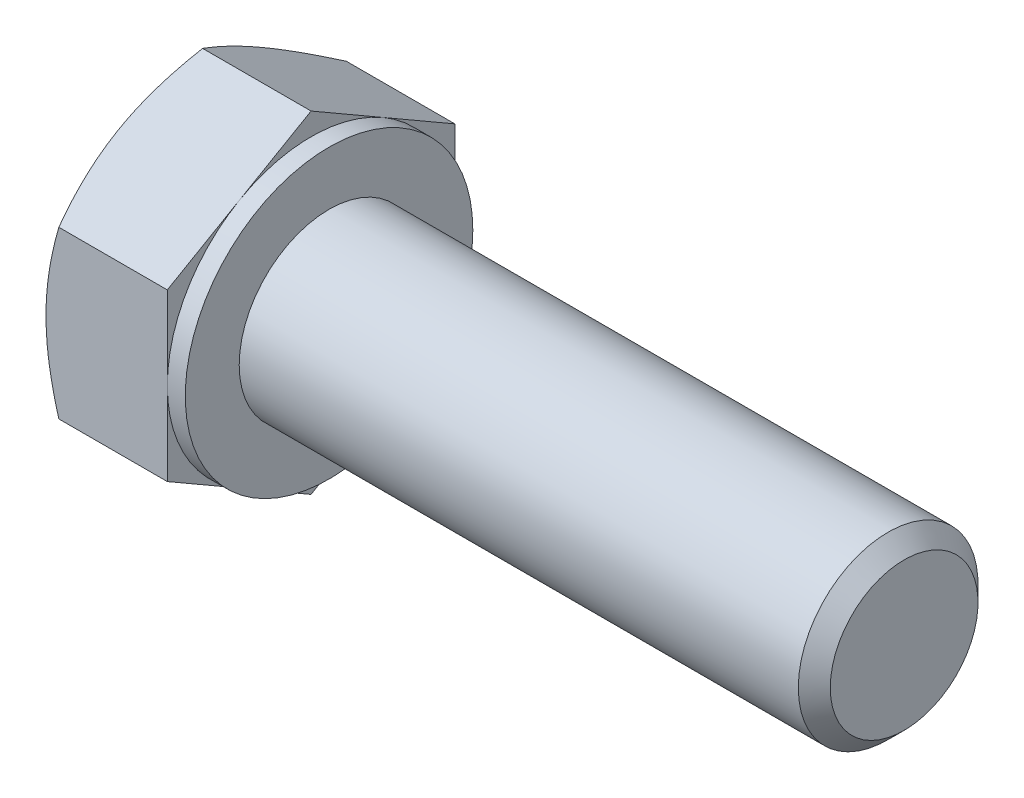
ISO-10303-21;
HEADER;
FILE_DESCRIPTION(('STEP AP214'),'2;1');
FILE_NAME('part.step','',(''),(''),'','','');
FILE_SCHEMA(('AUTOMOTIVE_DESIGN { 1 0 10303 214 1 1 1 1 }'));
ENDSEC;
DATA;
#1=APPLICATION_CONTEXT('core data for automotive mechanical design processes');
#2=APPLICATION_PROTOCOL_DEFINITION('international standard','automotive_design',2000,#1);
#3=PRODUCT_CONTEXT('',#1,'mechanical');
#4=PRODUCT('Part','Part','',(#3));
#5=PRODUCT_RELATED_PRODUCT_CATEGORY('part','',(#4));
#6=PRODUCT_DEFINITION_FORMATION('','',#4);
#7=PRODUCT_DEFINITION_CONTEXT('part definition',#1,'design');
#8=PRODUCT_DEFINITION('design','',#6,#7);
#9=PRODUCT_DEFINITION_SHAPE('','',#8);
#10=(LENGTH_UNIT() NAMED_UNIT(*) SI_UNIT(.MILLI.,.METRE.));
#11=(NAMED_UNIT(*) PLANE_ANGLE_UNIT() SI_UNIT($,.RADIAN.));
#12=(NAMED_UNIT(*) SI_UNIT($,.STERADIAN.) SOLID_ANGLE_UNIT());
#13=UNCERTAINTY_MEASURE_WITH_UNIT(LENGTH_MEASURE(1.E-05),#10,'distance_accuracy_value','');
#14=(GEOMETRIC_REPRESENTATION_CONTEXT(3) GLOBAL_UNCERTAINTY_ASSIGNED_CONTEXT((#13)) GLOBAL_UNIT_ASSIGNED_CONTEXT((#10,
#11,#12)) REPRESENTATION_CONTEXT('',''));
#15=CARTESIAN_POINT('',(0.,0.,0.));
#16=DIRECTION('',(0.,0.,1.));
#17=DIRECTION('',(1.,0.,0.));
#18=AXIS2_PLACEMENT_3D('',#15,#16,#17);
#19=CARTESIAN_POINT('',(3.875,4.61880215351701,0.));
#20=DIRECTION('',(1.,0.,0.));
#21=DIRECTION('',(0.,0.,-1.));
#22=AXIS2_PLACEMENT_3D('',#19,#20,#21);
#23=PLANE('',#22);
#24=CARTESIAN_POINT('',(3.875,0.,0.));
#25=DIRECTION('',(1.,0.,0.));
#26=DIRECTION('',(0.,0.,-1.));
#27=AXIS2_PLACEMENT_3D('',#24,#25,#26);
#28=CIRCLE('',#27,2.5);
#29=CARTESIAN_POINT('',(3.875,0.,-2.5));
#30=VERTEX_POINT('',#29);
#31=EDGE_CURVE('E306',#30,#30,#28,.F.);
#32=ORIENTED_EDGE('',*,*,#31,.T.);
#33=EDGE_LOOP('',(#32));
#34=FACE_BOUND('',#33,.T.);
#35=CARTESIAN_POINT('',(3.875,0.,0.));
#36=DIRECTION('',(1.,0.,0.));
#37=DIRECTION('',(0.,0.,-1.));
#38=AXIS2_PLACEMENT_3D('',#35,#36,#37);
#39=CIRCLE('',#38,4.);
#40=CARTESIAN_POINT('',(3.875,0.,-4.));
#41=VERTEX_POINT('',#40);
#42=EDGE_CURVE('E333',#41,#41,#39,.T.);
#43=ORIENTED_EDGE('',*,*,#42,.T.);
#44=EDGE_LOOP('',(#43));
#45=FACE_BOUND('',#44,.T.);
#46=ADVANCED_FACE('F45',(#34,#45),#23,.T.);
#47=CARTESIAN_POINT('',(0.,0.,0.));
#48=DIRECTION('',(-1.,0.,0.));
#49=DIRECTION('',(0.,0.,1.));
#50=AXIS2_PLACEMENT_3D('',#47,#48,#49);
#51=CYLINDRICAL_SURFACE('',#50,2.5);
#52=ORIENTED_EDGE('',*,*,#31,.F.);
#53=EDGE_LOOP('',(#52));
#54=FACE_BOUND('',#53,.T.);
#55=CARTESIAN_POINT('',(19.43,0.,0.));
#56=DIRECTION('',(-1.,0.,0.));
#57=DIRECTION('',(0.,0.,1.));
#58=AXIS2_PLACEMENT_3D('',#55,#56,#57);
#59=CIRCLE('',#58,2.5);
#60=CARTESIAN_POINT('',(19.43,0.,2.5));
#61=VERTEX_POINT('',#60);
#62=EDGE_CURVE('E300',#61,#61,#59,.T.);
#63=ORIENTED_EDGE('',*,*,#62,.T.);
#64=EDGE_LOOP('',(#63));
#65=FACE_BOUND('',#64,.T.);
#66=ADVANCED_FACE('F273',(#54,#65),#51,.T.);
#67=CARTESIAN_POINT('',(19.875,0.,0.));
#68=DIRECTION('',(-1.,0.,0.));
#69=DIRECTION('',(0.,0.,1.));
#70=AXIS2_PLACEMENT_3D('',#67,#68,#69);
#71=CONICAL_SURFACE('',#70,2.055,0.785398163397448);
#72=ORIENTED_EDGE('',*,*,#62,.F.);
#73=EDGE_LOOP('',(#72));
#74=FACE_BOUND('',#73,.T.);
#75=CARTESIAN_POINT('',(19.875,0.,0.));
#76=DIRECTION('',(-1.,0.,0.));
#77=DIRECTION('',(0.,0.,1.));
#78=AXIS2_PLACEMENT_3D('',#75,#76,#77);
#79=CIRCLE('',#78,2.055);
#80=CARTESIAN_POINT('',(19.875,0.,2.055));
#81=VERTEX_POINT('',#80);
#82=EDGE_CURVE('E297',#81,#81,#79,.T.);
#83=ORIENTED_EDGE('',*,*,#82,.T.);
#84=EDGE_LOOP('',(#83));
#85=FACE_BOUND('',#84,.T.);
#86=ADVANCED_FACE('F278',(#74,#85),#71,.T.);
#87=CARTESIAN_POINT('',(19.875,0.,0.));
#88=DIRECTION('',(-1.,0.,0.));
#89=DIRECTION('',(0.,0.,1.));
#90=AXIS2_PLACEMENT_3D('',#87,#88,#89);
#91=PLANE('',#90);
#92=ORIENTED_EDGE('',*,*,#82,.F.);
#93=EDGE_LOOP('',(#92));
#94=FACE_BOUND('',#93,.T.);
#95=ADVANCED_FACE('F285',(#94),#91,.F.);
#96=CARTESIAN_POINT('',(3.375,4.,0.));
#97=DIRECTION('',(1.,0.,0.));
#98=DIRECTION('',(0.,0.,-1.));
#99=AXIS2_PLACEMENT_3D('',#96,#97,#98);
#100=PLANE('',#99);
#101=DIRECTION('',(0.,0.500000000000002,0.866025403784438));
#102=VECTOR('',#101,1.);
#103=CARTESIAN_POINT('',(3.375,2.3094010767585,-4.));
#104=LINE('',#103,#102);
#105=CARTESIAN_POINT('',(3.375,2.3094010767585,-4.));
#106=VERTEX_POINT('',#105);
#107=CARTESIAN_POINT('',(3.375,3.46410161513775,-2.00000000000001));
#108=VERTEX_POINT('',#107);
#109=EDGE_CURVE('E187',#106,#108,#104,.T.);
#110=ORIENTED_EDGE('',*,*,#109,.T.);
#111=CARTESIAN_POINT('',(3.375,0.,0.));
#112=DIRECTION('',(-1.,0.,0.));
#113=DIRECTION('',(0.,0.,1.));
#114=AXIS2_PLACEMENT_3D('',#111,#112,#113);
#115=CIRCLE('',#114,4.);
#116=CARTESIAN_POINT('',(3.375,0.,-4.));
#117=VERTEX_POINT('',#116);
#118=EDGE_CURVE('E62',#108,#117,#115,.T.);
#119=ORIENTED_EDGE('',*,*,#118,.T.);
#120=DIRECTION('',(0.,1.,0.));
#121=VECTOR('',#120,1.);
#122=CARTESIAN_POINT('',(3.375,2.3094010767585,-4.));
#123=LINE('',#122,#121);
#124=EDGE_CURVE('E50',#117,#106,#123,.T.);
#125=ORIENTED_EDGE('',*,*,#124,.T.);
#126=EDGE_LOOP('',(#110,#119,#125));
#127=FACE_BOUND('',#126,.T.);
#128=ADVANCED_FACE('F288',(#127),#100,.T.);
#129=CARTESIAN_POINT('',(3.375,4.61880215351701,0.));
#130=VERTEX_POINT('',#129);
#131=EDGE_CURVE('E184',#108,#130,#104,.T.);
#132=ORIENTED_EDGE('',*,*,#131,.T.);
#133=DIRECTION('',(0.,-0.500000000000001,0.866025403784438));
#134=VECTOR('',#133,1.);
#135=CARTESIAN_POINT('',(3.375,4.61880215351701,0.));
#136=LINE('',#135,#134);
#137=CARTESIAN_POINT('',(3.375,3.46410161513775,2.));
#138=VERTEX_POINT('',#137);
#139=EDGE_CURVE('E183',#130,#138,#136,.T.);
#140=ORIENTED_EDGE('',*,*,#139,.T.);
#141=EDGE_CURVE('E167',#138,#108,#115,.T.);
#142=ORIENTED_EDGE('',*,*,#141,.T.);
#143=EDGE_LOOP('',(#132,#140,#142));
#144=FACE_BOUND('',#143,.T.);
#145=ADVANCED_FACE('F293',(#144),#100,.T.);
#146=CARTESIAN_POINT('',(3.375,2.30940107675851,3.99999999999999));
#147=VERTEX_POINT('',#146);
#148=EDGE_CURVE('E144',#138,#147,#136,.T.);
#149=ORIENTED_EDGE('',*,*,#148,.T.);
#150=DIRECTION('',(0.,-1.,0.));
#151=VECTOR('',#150,1.);
#152=CARTESIAN_POINT('',(3.375,2.30940107675851,3.99999999999999));
#153=LINE('',#152,#151);
#154=CARTESIAN_POINT('',(3.375,0.,4.));
#155=VERTEX_POINT('',#154);
#156=EDGE_CURVE('E138',#147,#155,#153,.T.);
#157=ORIENTED_EDGE('',*,*,#156,.T.);
#158=EDGE_CURVE('E142',#155,#138,#115,.T.);
#159=ORIENTED_EDGE('',*,*,#158,.T.);
#160=EDGE_LOOP('',(#149,#157,#159));
#161=FACE_BOUND('',#160,.T.);
#162=ADVANCED_FACE('F140',(#161),#100,.T.);
#163=CARTESIAN_POINT('',(3.375,-2.30940107675848,4.));
#164=VERTEX_POINT('',#163);
#165=EDGE_CURVE('E149',#155,#164,#153,.T.);
#166=ORIENTED_EDGE('',*,*,#165,.T.);
#167=DIRECTION('',(0.,-0.500000000000002,-0.866025403784438));
#168=VECTOR('',#167,1.);
#169=CARTESIAN_POINT('',(3.375,-4.618802153517,0.));
#170=LINE('',#169,#168);
#171=CARTESIAN_POINT('',(3.375,-3.46410161513775,2.00000000000001));
#172=VERTEX_POINT('',#171);
#173=EDGE_CURVE('E156',#164,#172,#170,.T.);
#174=ORIENTED_EDGE('',*,*,#173,.T.);
#175=EDGE_CURVE('E153',#172,#155,#115,.T.);
#176=ORIENTED_EDGE('',*,*,#175,.T.);
#177=EDGE_LOOP('',(#166,#174,#176));
#178=FACE_BOUND('',#177,.T.);
#179=ADVANCED_FACE('F154',(#178),#100,.T.);
#180=CARTESIAN_POINT('',(3.375,-4.618802153517,0.));
#181=VERTEX_POINT('',#180);
#182=EDGE_CURVE('E177',#172,#181,#170,.T.);
#183=ORIENTED_EDGE('',*,*,#182,.T.);
#184=DIRECTION('',(0.,0.499999999999999,-0.866025403784439));
#185=VECTOR('',#184,1.);
#186=CARTESIAN_POINT('',(3.375,-2.3094010767585,-4.));
#187=LINE('',#186,#185);
#188=CARTESIAN_POINT('',(3.375,-3.46410161513776,-1.99999999999999));
#189=VERTEX_POINT('',#188);
#190=EDGE_CURVE('E428',#181,#189,#187,.T.);
#191=ORIENTED_EDGE('',*,*,#190,.T.);
#192=EDGE_CURVE('E161',#189,#172,#115,.T.);
#193=ORIENTED_EDGE('',*,*,#192,.T.);
#194=EDGE_LOOP('',(#183,#191,#193));
#195=FACE_BOUND('',#194,.T.);
#196=ADVANCED_FACE('F537',(#195),#100,.T.);
#197=CARTESIAN_POINT('',(3.375,-2.3094010767585,-4.));
#198=VERTEX_POINT('',#197);
#199=EDGE_CURVE('E169',#189,#198,#187,.T.);
#200=ORIENTED_EDGE('',*,*,#199,.T.);
#201=EDGE_CURVE('E11',#198,#117,#123,.T.);
#202=ORIENTED_EDGE('',*,*,#201,.T.);
#203=EDGE_CURVE('E434',#117,#189,#115,.T.);
#204=ORIENTED_EDGE('',*,*,#203,.T.);
#205=EDGE_LOOP('',(#200,#202,#204));
#206=FACE_BOUND('',#205,.T.);
#207=ADVANCED_FACE('F294',(#206),#100,.T.);
#208=CARTESIAN_POINT('',(0.,0.,0.));
#209=DIRECTION('',(-1.,0.,0.));
#210=DIRECTION('',(0.,0.,1.));
#211=AXIS2_PLACEMENT_3D('',#208,#209,#210);
#212=CYLINDRICAL_SURFACE('',#211,4.);
#213=ORIENTED_EDGE('',*,*,#118,.F.);
#214=ORIENTED_EDGE('',*,*,#141,.F.);
#215=ORIENTED_EDGE('',*,*,#158,.F.);
#216=ORIENTED_EDGE('',*,*,#175,.F.);
#217=ORIENTED_EDGE('',*,*,#192,.F.);
#218=ORIENTED_EDGE('',*,*,#203,.F.);
#219=EDGE_LOOP('',(#213,#214,#215,#216,#217,#218));
#220=FACE_BOUND('',#219,.T.);
#221=ORIENTED_EDGE('',*,*,#42,.F.);
#222=EDGE_LOOP('',(#221));
#223=FACE_BOUND('',#222,.T.);
#224=ADVANCED_FACE('F164',(#220,#223),#212,.T.);
#225=CARTESIAN_POINT('',(0.,4.61880215351701,0.));
#226=DIRECTION('',(1.,0.,0.));
#227=DIRECTION('',(0.,0.,-1.));
#228=AXIS2_PLACEMENT_3D('',#225,#226,#227);
#229=PLANE('',#228);
#230=CARTESIAN_POINT('',(0.,0.,0.));
#231=DIRECTION('',(1.,0.,0.));
#232=DIRECTION('',(0.,0.,-1.));
#233=AXIS2_PLACEMENT_3D('',#230,#231,#232);
#234=CIRCLE('',#233,4.);
#235=CARTESIAN_POINT('',(0.,0.,-4.));
#236=VERTEX_POINT('',#235);
#237=CARTESIAN_POINT('',(0.,3.46410161513775,-2.00000000000001));
#238=VERTEX_POINT('',#237);
#239=EDGE_CURVE('E332',#236,#238,#234,.T.);
#240=ORIENTED_EDGE('',*,*,#239,.F.);
#241=CARTESIAN_POINT('',(0.,-3.46410161513776,-1.99999999999999));
#242=VERTEX_POINT('',#241);
#243=EDGE_CURVE('E328',#242,#236,#234,.T.);
#244=ORIENTED_EDGE('',*,*,#243,.F.);
#245=CARTESIAN_POINT('',(0.,-3.46410161513775,2.00000000000001));
#246=VERTEX_POINT('',#245);
#247=EDGE_CURVE('E331',#246,#242,#234,.T.);
#248=ORIENTED_EDGE('',*,*,#247,.F.);
#249=CARTESIAN_POINT('',(0.,0.,4.));
#250=VERTEX_POINT('',#249);
#251=EDGE_CURVE('E347',#250,#246,#234,.T.);
#252=ORIENTED_EDGE('',*,*,#251,.F.);
#253=CARTESIAN_POINT('',(0.,0.,0.));
#254=DIRECTION('',(-1.,0.,0.));
#255=DIRECTION('',(0.,0.,1.));
#256=AXIS2_PLACEMENT_3D('',#253,#254,#255);
#257=CIRCLE('',#256,4.);
#258=CARTESIAN_POINT('',(0.,3.46410161513775,2.));
#259=VERTEX_POINT('',#258);
#260=EDGE_CURVE('E188',#250,#259,#257,.T.);
#261=ORIENTED_EDGE('',*,*,#260,.T.);
#262=EDGE_CURVE('E340',#238,#259,#234,.T.);
#263=ORIENTED_EDGE('',*,*,#262,.F.);
#264=EDGE_LOOP('',(#240,#244,#248,#252,#261,#263));
#265=FACE_BOUND('',#264,.T.);
#266=ADVANCED_FACE('F221',(#265),#229,.F.);
#267=CARTESIAN_POINT('',(0.,0.,0.));
#268=DIRECTION('',(1.,0.,0.));
#269=DIRECTION('',(0.,0.,-1.));
#270=AXIS2_PLACEMENT_3D('',#267,#268,#269);
#271=CONICAL_SURFACE('',#270,4.,1.0471975511966);
#272=CARTESIAN_POINT('',(0.357332259074764,2.30928560670467,4.00019999999999));
#273=CARTESIAN_POINT('',(0.29871787364828,2.41077174646171,3.82442084967676));
#274=CARTESIAN_POINT('',(0.245410321462261,2.513133908835,3.64712438367361));
#275=CARTESIAN_POINT('',(0.152361670746402,2.71963072479812,3.28946140682429));
#276=CARTESIAN_POINT('',(0.112653489029703,2.82376904741905,3.10908854102984));
#277=CARTESIAN_POINT('',(0.0508422152802788,3.03075510011796,2.7505781812972));
#278=CARTESIAN_POINT('',(0.028327731522889,3.13357098372492,2.57249584706485));
#279=CARTESIAN_POINT('',(0.00145062314658275,3.33968651028529,2.21549328283349));
#280=CARTESIAN_POINT('',(-0.00293425857305552,3.44298540411435,2.03657435035589));
#281=CARTESIAN_POINT('',(0.00619007293997221,3.63600352522933,1.70225715780326));
#282=CARTESIAN_POINT('',(0.0174589539879965,3.72575165335065,1.54680884001293));
#283=CARTESIAN_POINT('',(0.0531739907981958,3.90466320392055,1.23692494436494));
#284=CARTESIAN_POINT('',(0.0776323457115357,3.99382600759479,1.08249043825587));
#285=CARTESIAN_POINT('',(0.138776064919292,4.17310641015198,0.77196767222542));
#286=CARTESIAN_POINT('',(0.175720603654866,4.26320131938132,0.615918711936896));
#287=CARTESIAN_POINT('',(0.25957007254803,4.44204742827551,0.30614816459616));
#288=CARTESIAN_POINT('',(0.306455302212743,4.53080091904967,0.152422609226221));
#289=CARTESIAN_POINT('',(0.35733225907477,4.61891762357085,-0.000200000000000127));
#290=B_SPLINE_CURVE_WITH_KNOTS('',3,(#272,#273,#274,#275,#276,#277,#278,#279,#280,#281,#282,
#283,#284,#285,#286,#287,#288,#289),.UNSPECIFIED.,.F.,.F.,(4,2,2,2,2,2,2,2,4),(0.,
0.634047835695966,1.26961969224543,1.88946157213122,2.50854226669297,3.04757825393385,
3.58711366126903,4.13861653143763,4.68903648037742),.UNSPECIFIED.);
#291=CARTESIAN_POINT('',(0.357265589908165,4.61880215351701,0.));
#292=VERTEX_POINT('',#291);
#293=EDGE_CURVE('E241',#259,#292,#290,.T.);
#294=ORIENTED_EDGE('',*,*,#293,.T.);
#295=CARTESIAN_POINT('',(0.357332259074769,4.61891762357085,0.000200000000000014));
#296=CARTESIAN_POINT('',(0.298717873648285,4.51743148381381,-0.175579150323228));
#297=CARTESIAN_POINT('',(0.245410321462265,4.41506932144052,-0.352875616326381));
#298=CARTESIAN_POINT('',(0.152361670746406,4.2085725054774,-0.710538593175707));
#299=CARTESIAN_POINT('',(0.112653489029706,4.10443418285647,-0.890911458970151));
#300=CARTESIAN_POINT('',(0.0508422152802806,3.89744813015756,-1.24942181870279));
#301=CARTESIAN_POINT('',(0.0283277315228901,3.7946322465506,-1.42750415293514));
#302=CARTESIAN_POINT('',(0.00145062314658247,3.58851671999023,-1.78450671716651));
#303=CARTESIAN_POINT('',(-0.00293425857305642,3.48521782616117,-1.9634256496441));
#304=CARTESIAN_POINT('',(0.0061900729399703,3.29219970504619,-2.29774284219673));
#305=CARTESIAN_POINT('',(0.0174589539879942,3.20245157692486,-2.45319115998707));
#306=CARTESIAN_POINT('',(0.0531739907981929,3.02354002635497,-2.76307505563506));
#307=CARTESIAN_POINT('',(0.0776323457115325,2.93437722268073,-2.91750956174413));
#308=CARTESIAN_POINT('',(0.138776064919288,2.75509682012354,-3.22803232777458));
#309=CARTESIAN_POINT('',(0.175720603654862,2.6650019108942,-3.3840812880631));
#310=CARTESIAN_POINT('',(0.259570072548025,2.486155802,-3.69385183540384));
#311=CARTESIAN_POINT('',(0.306455302212738,2.39740231122584,-3.84757739077378));
#312=CARTESIAN_POINT('',(0.357332259074764,2.30928560670466,-4.0002));
#313=B_SPLINE_CURVE_WITH_KNOTS('',3,(#295,#296,#297,#298,#299,#300,#301,#302,#303,#304,#305,
#306,#307,#308,#309,#310,#311,#312),.UNSPECIFIED.,.F.,.F.,(4,2,2,2,2,2,2,2,4),(0.,
0.634047835695967,1.26961969224544,1.88946157213122,2.50854226669297,3.04757825393386,
3.58711366126904,4.13861653143764,4.68903648037744),.UNSPECIFIED.);
#314=EDGE_CURVE('E70',#292,#238,#313,.T.);
#315=ORIENTED_EDGE('',*,*,#314,.T.);
#316=ORIENTED_EDGE('',*,*,#262,.T.);
#317=EDGE_LOOP('',(#294,#315,#316));
#318=FACE_BOUND('',#317,.T.);
#319=ADVANCED_FACE('F452',(#318),#271,.T.);
#320=CARTESIAN_POINT('',(2.00011120385046,-6.3020384234118,4.));
#321=CARTESIAN_POINT('',(1.91454696302706,-6.12645846502783,4.));
#322=CARTESIAN_POINT('',(1.82977515690346,-5.95048585438814,4.));
#323=CARTESIAN_POINT('',(1.66226027661303,-5.59754684141579,4.));
#324=CARTESIAN_POINT('',(1.57951750403357,-5.42058029609573,4.));
#325=CARTESIAN_POINT('',(1.4161092617051,-5.06457985037646,4.));
#326=CARTESIAN_POINT('',(1.33545672605323,-4.88553999327038,4.));
#327=CARTESIAN_POINT('',(1.17732357965482,-4.52607013031636,4.));
#328=CARTESIAN_POINT('',(1.09984282527701,-4.34564018785782,4.));
#329=CARTESIAN_POINT('',(0.946328317401932,-3.97695712218341,4.));
#330=CARTESIAN_POINT('',(0.870432703669638,-3.78864617451162,4.));
#331=CARTESIAN_POINT('',(0.724150215280466,-3.40985798807119,4.));
#332=CARTESIAN_POINT('',(0.653763944661545,-3.21938051438195,4.));
#333=CARTESIAN_POINT('',(0.520275623047364,-2.83628176991271,4.));
#334=CARTESIAN_POINT('',(0.45715965099107,-2.64366539743604,4.));
#335=CARTESIAN_POINT('',(0.340171517307153,-2.25567134243401,4.));
#336=CARTESIAN_POINT('',(0.286296547451801,-2.0602945183805,4.));
#337=CARTESIAN_POINT('',(0.190596079734454,-1.66775019550377,4.));
#338=CARTESIAN_POINT('',(0.148703055513719,-1.47059946088018,4.));
#339=CARTESIAN_POINT('',(0.0792701946386882,-1.07374632394225,4.));
#340=CARTESIAN_POINT('',(0.0517287926791938,-0.874044202338187,4.));
#341=CARTESIAN_POINT('',(0.0135517370726247,-0.475733693101267,4.));
#342=CARTESIAN_POINT('',(0.00269106574828705,-0.277147419592167,4.));
#343=CARTESIAN_POINT('',(-0.00180277188208441,0.120241435280114,4.));
#344=CARTESIAN_POINT('',(0.00456430925773631,0.319044019709218,4.));
#345=CARTESIAN_POINT('',(0.0293199840216128,0.653649130511212,4.));
#346=CARTESIAN_POINT('',(0.0433487693682711,0.789796203877412,3.99999999999999));
#347=CARTESIAN_POINT('',(0.078665058314609,1.06115179654903,3.99999999999999));
#348=CARTESIAN_POINT('',(0.0999534649347827,1.19636019695748,3.99999999999999));
#349=CARTESIAN_POINT('',(0.173595112588807,1.60036108675972,3.99999999999999));
#350=CARTESIAN_POINT('',(0.235713609104601,1.86739657992387,3.99999999999999));
#351=CARTESIAN_POINT('',(0.344187906710576,2.26690842076046,3.99999999999999));
#352=CARTESIAN_POINT('',(0.383434483337922,2.40143348236976,3.99999999999999));
#353=CARTESIAN_POINT('',(0.466191101497679,2.6691784914414,3.99999999999999));
#354=CARTESIAN_POINT('',(0.509701176020063,2.8023984287962,3.99999999999999));
#355=CARTESIAN_POINT('',(0.600271093153284,3.06757339019426,3.99999999999999));
#356=CARTESIAN_POINT('',(0.647329942526204,3.19952875660039,3.99999999999999));
#357=CARTESIAN_POINT('',(0.744425095187852,3.46233233841869,3.99999999999999));
#358=CARTESIAN_POINT('',(0.79446132942051,3.59318057942866,3.99999999999999));
#359=CARTESIAN_POINT('',(0.933355738336686,3.94627302000952,3.99999999999999));
#360=CARTESIAN_POINT('',(1.02459875944488,4.16757823468635,3.99999999999999));
#361=CARTESIAN_POINT('',(1.21247228327858,4.60789849544448,3.99999999999999));
#362=CARTESIAN_POINT('',(1.30910339202328,4.82691328060903,3.99999999999999));
#363=CARTESIAN_POINT('',(1.50647026541792,5.26317250155478,3.99999999999999));
#364=CARTESIAN_POINT('',(1.60720746834517,5.48041628445573,3.99999999999999));
#365=CARTESIAN_POINT('',(1.81181128465854,5.91342831583171,3.99999999999999));
#366=CARTESIAN_POINT('',(1.91567799508362,6.12919651829726,3.99999999999999));
#367=CARTESIAN_POINT('',(2.1260176887459,6.55988021726239,3.99999999999999));
#368=CARTESIAN_POINT('',(2.23249454398487,6.77479381881755,3.99999999999999));
#369=CARTESIAN_POINT('',(2.44739203587053,7.20364802853134,3.99999999999999));
#370=CARTESIAN_POINT('',(2.55581269331615,7.41758862624798,3.99999999999999));
#371=CARTESIAN_POINT('',(2.88334503455634,8.05812603320374,3.99999999999999));
#372=CARTESIAN_POINT('',(3.10477549323411,8.48353660300324,3.99999999999999));
#373=CARTESIAN_POINT('',(3.52798949335262,9.28704830216621,3.99999999999998));
#374=CARTESIAN_POINT('',(3.72935795048665,9.66536912757713,3.99999999999998));
#375=CARTESIAN_POINT('',(4.13451859162103,10.4207405569166,3.99999999999998));
#376=CARTESIAN_POINT('',(4.33831092670878,10.7977910797637,3.99999999999998));
#377=CARTESIAN_POINT('',(4.74699525515911,11.5496417866802,3.99999999999998));
#378=CARTESIAN_POINT('',(4.95188119224406,11.9244452679585,3.99999999999998));
#379=CARTESIAN_POINT('',(5.36302659523093,12.673259459655,3.99999999999998));
#380=CARTESIAN_POINT('',(5.56928595009505,13.0472702310148,3.99999999999998));
#381=CARTESIAN_POINT('',(5.77604503303505,13.4210028084018,3.99999999999998));
#382=B_SPLINE_CURVE_WITH_KNOTS('',3,(#320,#321,#322,#323,#324,#325,#326,#327,#328,#329,#330,
#331,#332,#333,#334,#335,#336,#337,#338,#339,#340,#341,#342,#343,#344,#345,#346,#347,#348,#349,
#350,#351,#352,#353,#354,#355,#356,#357,#358,#359,#360,#361,#362,#363,#364,#365,#366,#367,#368,
#369,#370,#371,#372,#373,#374,#375,#376,#377,#378,#379,#380,#381),.UNSPECIFIED.,.F.,.F.,(4,2,2,
2,2,2,2,2,2,2,2,2,2,2,2,2,2,2,2,2,2,2,2,2,2,2,2,2,2,2,4),(0.,0.585964079589227,1.1720147329867,
1.76109183439221,2.35014223039207,2.95916537113301,3.56825519120251,4.17615863495933,
4.7838770157301,5.38809978568041,5.99225664035711,6.58818972380393,7.18413136680919,
7.59453802315342,8.00499574839965,8.82630883348705,9.24666973074843,9.66703388092332,
10.0872808123363,10.5075180005348,11.2255416622243,11.9436462463738,12.6620045660407,
13.3803851833438,14.0999050636407,14.8194326474842,16.2581595478086,17.5438734370163,
18.8296678929703,20.1111105384062,21.3924508103747),.UNSPECIFIED.);
#383=CARTESIAN_POINT('',(0.35726558990816,2.30940107675851,3.99999999999999));
#384=VERTEX_POINT('',#383);
#385=EDGE_CURVE('E256',#250,#384,#382,.T.);
#386=ORIENTED_EDGE('',*,*,#385,.T.);
#387=EDGE_CURVE('E255',#384,#259,#290,.T.);
#388=ORIENTED_EDGE('',*,*,#387,.T.);
#389=ORIENTED_EDGE('',*,*,#260,.F.);
#390=EDGE_LOOP('',(#386,#388,#389));
#391=FACE_BOUND('',#390,.T.);
#392=ADVANCED_FACE('F454',(#391),#271,.T.);
#393=CARTESIAN_POINT('',(0.357265589908155,-2.30940107675848,4.));
#394=VERTEX_POINT('',#393);
#395=EDGE_CURVE('E301',#394,#250,#382,.T.);
#396=ORIENTED_EDGE('',*,*,#395,.T.);
#397=ORIENTED_EDGE('',*,*,#251,.T.);
#398=CARTESIAN_POINT('',(0.357332259074761,-4.61891762357084,-0.000200000000000053));
#399=CARTESIAN_POINT('',(0.298717873648276,-4.5174314838138,0.175579150323227));
#400=CARTESIAN_POINT('',(0.245410321462257,-4.41506932144051,0.352875616326379));
#401=CARTESIAN_POINT('',(0.152361670746397,-4.20857250547739,0.710538593175703));
#402=CARTESIAN_POINT('',(0.112653489029698,-4.10443418285646,0.890911458970147));
#403=CARTESIAN_POINT('',(0.0508422152802724,-3.89744813015755,1.24942181870279));
#404=CARTESIAN_POINT('',(0.0283277315228824,-3.79463224655058,1.42750415293514));
#405=CARTESIAN_POINT('',(0.00145062314657475,-3.58851671999022,1.7845067171665));
#406=CARTESIAN_POINT('',(-0.00293425857306463,-3.48521782616116,1.96342564964409));
#407=CARTESIAN_POINT('',(0.00619007293996155,-3.29219970504618,2.29774284219672));
#408=CARTESIAN_POINT('',(0.0174589539879854,-3.20245157692485,2.45319115998706));
#409=CARTESIAN_POINT('',(0.0531739907981842,-3.02354002635495,2.76307505563505));
#410=CARTESIAN_POINT('',(0.0776323457115241,-2.93437722268071,2.91750956174413));
#411=CARTESIAN_POINT('',(0.138776064919281,-2.75509682012352,3.22803232777457));
#412=CARTESIAN_POINT('',(0.175720603654855,-2.66500191089418,3.3840812880631));
#413=CARTESIAN_POINT('',(0.259570072548019,-2.48615580199999,3.69385183540384));
#414=CARTESIAN_POINT('',(0.306455302212732,-2.39740231122583,3.84757739077378));
#415=CARTESIAN_POINT('',(0.35733225907476,-2.30928560670465,4.0002));
#416=B_SPLINE_CURVE_WITH_KNOTS('',3,(#398,#399,#400,#401,#402,#403,#404,#405,#406,#407,#408,
#409,#410,#411,#412,#413,#414,#415),.UNSPECIFIED.,.F.,.F.,(4,2,2,2,2,2,2,2,4),(0.,
0.634047835695964,1.26961969224543,1.88946157213122,2.50854226669296,3.04757825393385,
3.58711366126903,4.13861653143764,4.68903648037744),.UNSPECIFIED.);
#417=EDGE_CURVE('E243',#246,#394,#416,.T.);
#418=ORIENTED_EDGE('',*,*,#417,.T.);
#419=EDGE_LOOP('',(#396,#397,#418));
#420=FACE_BOUND('',#419,.T.);
#421=ADVANCED_FACE('F210',(#420),#271,.T.);
#422=CARTESIAN_POINT('',(0.357265589908157,-4.618802153517,0.));
#423=VERTEX_POINT('',#422);
#424=EDGE_CURVE('E234',#423,#246,#416,.T.);
#425=ORIENTED_EDGE('',*,*,#424,.T.);
#426=ORIENTED_EDGE('',*,*,#247,.T.);
#427=CARTESIAN_POINT('',(0.357332259074766,-2.30928560670466,-4.0002));
#428=CARTESIAN_POINT('',(0.298717873648281,-2.4107717464617,-3.82442084967677));
#429=CARTESIAN_POINT('',(0.245410321462262,-2.51313390883499,-3.64712438367362));
#430=CARTESIAN_POINT('',(0.152361670746402,-2.71963072479811,-3.28946140682429));
#431=CARTESIAN_POINT('',(0.112653489029703,-2.82376904741904,-3.10908854102985));
#432=CARTESIAN_POINT('',(0.0508422152802774,-3.03075510011795,-2.75057818129721));
#433=CARTESIAN_POINT('',(0.0283277315228871,-3.13357098372491,-2.57249584706486));
#434=CARTESIAN_POINT('',(0.0014506231465795,-3.33968651028528,-2.21549328283349));
#435=CARTESIAN_POINT('',(-0.00293425857305966,-3.44298540411434,-2.0365743503559));
#436=CARTESIAN_POINT('',(0.00619007293996703,-3.63600352522932,-1.70225715780327));
#437=CARTESIAN_POINT('',(0.0174589539879911,-3.72575165335064,-1.54680884001293));
#438=CARTESIAN_POINT('',(0.0531739907981895,-3.90466320392054,-1.23692494436494));
#439=CARTESIAN_POINT('',(0.0776323457115289,-3.99382600759478,-1.08249043825587));
#440=CARTESIAN_POINT('',(0.138776064919284,-4.17310641015196,-0.771967672225422));
#441=CARTESIAN_POINT('',(0.175720603654858,-4.2632013193813,-0.615918711936897));
#442=CARTESIAN_POINT('',(0.259570072548022,-4.44204742827549,-0.30614816459616));
#443=CARTESIAN_POINT('',(0.306455302212734,-4.53080091904965,-0.152422609226221));
#444=CARTESIAN_POINT('',(0.357332259074761,-4.61891762357084,0.000199999999999998));
#445=B_SPLINE_CURVE_WITH_KNOTS('',3,(#427,#428,#429,#430,#431,#432,#433,#434,#435,#436,#437,
#438,#439,#440,#441,#442,#443,#444),.UNSPECIFIED.,.F.,.F.,(4,2,2,2,2,2,2,2,4),(0.,
0.634047835695965,1.26961969224543,1.88946157213122,2.50854226669297,3.04757825393386,
3.58711366126903,4.13861653143763,4.68903648037743),.UNSPECIFIED.);
#446=EDGE_CURVE('E242',#242,#423,#445,.T.);
#447=ORIENTED_EDGE('',*,*,#446,.T.);
#448=EDGE_LOOP('',(#425,#426,#447));
#449=FACE_BOUND('',#448,.T.);
#450=ADVANCED_FACE('F361',(#449),#271,.T.);
#451=CARTESIAN_POINT('',(0.357265589908161,2.3094010767585,-4.));
#452=VERTEX_POINT('',#451);
#453=EDGE_CURVE('E244',#238,#452,#313,.T.);
#454=ORIENTED_EDGE('',*,*,#453,.T.);
#455=CARTESIAN_POINT('',(2.00011120589743,-6.30203842761113,-4.));
#456=CARTESIAN_POINT('',(1.91454696498875,-6.12645846908574,-4.));
#457=CARTESIAN_POINT('',(1.82977515877992,-5.95048585830456,-4.));
#458=CARTESIAN_POINT('',(1.66226027831945,-5.59754684504877,-4.));
#459=CARTESIAN_POINT('',(1.57951750565517,-5.42058029958678,-4.));
#460=CARTESIAN_POINT('',(1.41610926315704,-5.06457985358152,-4.));
#461=CARTESIAN_POINT('',(1.33545672742032,-4.88553999633137,-4.));
#462=CARTESIAN_POINT('',(1.17732358085363,-4.52607013308825,-4.));
#463=CARTESIAN_POINT('',(1.09984282639237,-4.34564019048468,-4.));
#464=CARTESIAN_POINT('',(0.946328318347816,-3.97695712450867,-4.));
#465=CARTESIAN_POINT('',(0.870432704529691,-3.78864617668021,-4.));
#466=CARTESIAN_POINT('',(0.724150215973389,-3.40985798992395,-4.));
#467=CARTESIAN_POINT('',(0.653763945273171,-3.21938051607555,-4.));
#468=CARTESIAN_POINT('',(0.520275623504083,-2.83628177128505,-4.));
#469=CARTESIAN_POINT('',(0.457159651374154,-2.64366539864628,-4.));
#470=CARTESIAN_POINT('',(0.340171517554841,-2.25567134331569,-4.));
#471=CARTESIAN_POINT('',(0.286296547637719,-2.0602945190957,-4.));
#472=CARTESIAN_POINT('',(0.190596079795569,-1.66775019580151,-4.));
#473=CARTESIAN_POINT('',(0.148703055516466,-1.47059946092578,-4.));
#474=CARTESIAN_POINT('',(0.0792701945625818,-1.07374632347739,-4.));
#475=CARTESIAN_POINT('',(0.0517287925825738,-0.874044201615009,-4.));
#476=CARTESIAN_POINT('',(0.0135517369810981,-0.475733691865663,-4.));
#477=CARTESIAN_POINT('',(0.0026910656815035,-0.277147418102509,-4.));
#478=CARTESIAN_POINT('',(-0.00180277185473642,0.120241437274124,-4.));
#479=CARTESIAN_POINT('',(0.00456430935448331,0.319044021953527,-4.));
#480=CARTESIAN_POINT('',(0.0293199842587327,0.653649133068293,-4.));
#481=CARTESIAN_POINT('',(0.0433487696608973,0.789796206499809,-4.));
#482=CARTESIAN_POINT('',(0.0786650587211748,1.06115179929909,-4.));
#483=CARTESIAN_POINT('',(0.0999534653997823,1.19636019976989,-4.));
#484=CARTESIAN_POINT('',(0.173595113230303,1.6003610897557,-4.));
#485=CARTESIAN_POINT('',(0.235713609865278,1.86739658303731,-4.));
#486=CARTESIAN_POINT('',(0.344187907647022,2.26690842404957,-4.));
#487=CARTESIAN_POINT('',(0.383434484333357,2.40143348571872,-4.));
#488=CARTESIAN_POINT('',(0.466191102609246,2.66917849490934,-4.));
#489=CARTESIAN_POINT('',(0.509701177188773,2.8023984323233,-4.));
#490=CARTESIAN_POINT('',(0.600271094434185,3.06757339383921,-4.));
#491=CARTESIAN_POINT('',(0.647329943862149,3.19952876030403,-4.));
#492=CARTESIAN_POINT('',(0.744425096631929,3.46233234223972,-4.));
#493=CARTESIAN_POINT('',(0.794461330917674,3.5931805833084,-4.));
#494=CARTESIAN_POINT('',(0.933355739925495,3.9462730239221,-4.));
#495=CARTESIAN_POINT('',(1.0245987610664,4.16757823857484,-4.));
#496=CARTESIAN_POINT('',(1.21247228495599,4.6078984992879,-4.));
#497=CARTESIAN_POINT('',(1.30910339372387,4.82691328443148,-4.));
#498=CARTESIAN_POINT('',(1.50647026715799,5.26317250533754,-4.));
#499=CARTESIAN_POINT('',(1.60720747010151,5.48041628821979,-4.));
#500=CARTESIAN_POINT('',(1.81181128644257,5.91342831956033,-4.));
#501=CARTESIAN_POINT('',(1.91567799687904,6.12919652200915,-4.));
#502=CARTESIAN_POINT('',(2.12601769056008,6.55988022094133,-4.));
#503=CARTESIAN_POINT('',(2.23249454580639,6.77479382248026,-4.));
#504=CARTESIAN_POINT('',(2.44739203770408,7.20364803216284,-4.));
#505=CARTESIAN_POINT('',(2.55581269515436,7.41758862986447,-4.));
#506=CARTESIAN_POINT('',(2.88334503640577,8.05812603677695,-4.));
#507=CARTESIAN_POINT('',(3.10477549508713,8.48353660654958,-4.));
#508=CARTESIAN_POINT('',(3.52798949521968,9.28704830568598,-4.));
#509=CARTESIAN_POINT('',(3.72935795236482,9.66536913109685,-4.));
#510=CARTESIAN_POINT('',(4.13451859351915,10.4207405604373,-4.));
#511=CARTESIAN_POINT('',(4.33831092861575,10.7977910832853,-4.));
#512=CARTESIAN_POINT('',(4.74699525708428,11.5496417902084,-4.));
#513=CARTESIAN_POINT('',(4.95188119417862,11.9244452714923,-4.));
#514=CARTESIAN_POINT('',(5.36302659718327,12.6732594632005,-4.));
#515=CARTESIAN_POINT('',(5.56928595205576,13.0472702345667,-4.));
#516=CARTESIAN_POINT('',(5.7760450350038,13.42100281196,-4.));
#517=B_SPLINE_CURVE_WITH_KNOTS('',3,(#455,#456,#457,#458,#459,#460,#461,#462,#463,#464,#465,
#466,#467,#468,#469,#470,#471,#472,#473,#474,#475,#476,#477,#478,#479,#480,#481,#482,#483,#484,
#485,#486,#487,#488,#489,#490,#491,#492,#493,#494,#495,#496,#497,#498,#499,#500,#501,#502,#503,
#504,#505,#506,#507,#508,#509,#510,#511,#512,#513,#514,#515,#516),.UNSPECIFIED.,.F.,.F.,(4,2,2,
2,2,2,2,2,2,2,2,2,2,2,2,2,2,2,2,2,2,2,2,2,2,2,2,2,2,2,4),(0.,0.585964080082646,1.17201473397361,
1.76109183587772,2.35014223237615,2.95916537364923,3.56825519425104,4.17615863853847,
4.78387701983944,5.3880997905644,5.99225664601462,6.58818973021547,7.1841313739751,
7.59453803053127,8.00499575598947,8.82630884150173,9.2466697389851,9.66703388938198,
10.0872808210163,10.5075180094363,11.2255416710968,11.9436462552169,12.6620045748535,
13.3803851921263,14.0999050723894,14.8194326561991,16.2581595564571,17.5438734456803,
18.8296679016496,20.1111105471136,21.3924508191106),.UNSPECIFIED.);
#518=EDGE_CURVE('E202',#452,#236,#517,.F.);
#519=ORIENTED_EDGE('',*,*,#518,.T.);
#520=ORIENTED_EDGE('',*,*,#239,.T.);
#521=EDGE_LOOP('',(#454,#519,#520));
#522=FACE_BOUND('',#521,.T.);
#523=ADVANCED_FACE('F382',(#522),#271,.T.);
#524=CARTESIAN_POINT('',(0.357265589908044,-2.30940107675868,-4.));
#525=VERTEX_POINT('',#524);
#526=EDGE_CURVE('E203',#525,#242,#445,.T.);
#527=ORIENTED_EDGE('',*,*,#526,.T.);
#528=ORIENTED_EDGE('',*,*,#243,.T.);
#529=EDGE_CURVE('E192',#236,#525,#517,.F.);
#530=ORIENTED_EDGE('',*,*,#529,.T.);
#531=EDGE_LOOP('',(#527,#528,#530));
#532=FACE_BOUND('',#531,.T.);
#533=ADVANCED_FACE('F219',(#532),#271,.T.);
#534=CARTESIAN_POINT('',(3.875,2.3094010767585,-4.));
#535=DIRECTION('',(0.,0.,1.));
#536=DIRECTION('',(0.,-1.,0.));
#537=AXIS2_PLACEMENT_3D('',#534,#535,#536);
#538=PLANE('',#537);
#539=ORIENTED_EDGE('',*,*,#201,.F.);
#540=DIRECTION('',(-1.,0.,0.));
#541=VECTOR('',#540,1.);
#542=CARTESIAN_POINT('',(3.875,-2.3094010767585,-4.));
#543=LINE('',#542,#541);
#544=EDGE_CURVE('E314',#198,#525,#543,.T.);
#545=ORIENTED_EDGE('',*,*,#544,.T.);
#546=ORIENTED_EDGE('',*,*,#529,.F.);
#547=ORIENTED_EDGE('',*,*,#518,.F.);
#548=DIRECTION('',(-1.,0.,0.));
#549=VECTOR('',#548,1.);
#550=CARTESIAN_POINT('',(3.875,2.3094010767585,-4.));
#551=LINE('',#550,#549);
#552=EDGE_CURVE('E311',#106,#452,#551,.T.);
#553=ORIENTED_EDGE('',*,*,#552,.F.);
#554=ORIENTED_EDGE('',*,*,#124,.F.);
#555=EDGE_LOOP('',(#539,#545,#546,#547,#553,#554));
#556=FACE_BOUND('',#555,.T.);
#557=ADVANCED_FACE('F214',(#556),#538,.F.);
#558=CARTESIAN_POINT('',(3.875,-2.3094010767585,-4.));
#559=DIRECTION('',(0.,0.866025403784439,0.499999999999999));
#560=DIRECTION('',(0.,-0.499999999999999,0.866025403784439));
#561=AXIS2_PLACEMENT_3D('',#558,#559,#560);
#562=PLANE('',#561);
#563=ORIENTED_EDGE('',*,*,#190,.F.);
#564=DIRECTION('',(-1.,0.,0.));
#565=VECTOR('',#564,1.);
#566=CARTESIAN_POINT('',(3.875,-4.618802153517,0.));
#567=LINE('',#566,#565);
#568=EDGE_CURVE('E317',#181,#423,#567,.T.);
#569=ORIENTED_EDGE('',*,*,#568,.T.);
#570=ORIENTED_EDGE('',*,*,#446,.F.);
#571=ORIENTED_EDGE('',*,*,#526,.F.);
#572=ORIENTED_EDGE('',*,*,#544,.F.);
#573=ORIENTED_EDGE('',*,*,#199,.F.);
#574=EDGE_LOOP('',(#563,#569,#570,#571,#572,#573));
#575=FACE_BOUND('',#574,.T.);
#576=ADVANCED_FACE('F218',(#575),#562,.F.);
#577=CARTESIAN_POINT('',(3.875,-4.618802153517,0.));
#578=DIRECTION('',(0.,0.866025403784438,-0.500000000000002));
#579=DIRECTION('',(0.,0.500000000000002,0.866025403784438));
#580=AXIS2_PLACEMENT_3D('',#577,#578,#579);
#581=PLANE('',#580);
#582=ORIENTED_EDGE('',*,*,#173,.F.);
#583=DIRECTION('',(-1.,0.,0.));
#584=VECTOR('',#583,1.);
#585=CARTESIAN_POINT('',(3.875,-2.30940107675848,4.));
#586=LINE('',#585,#584);
#587=EDGE_CURVE('E173',#164,#394,#586,.T.);
#588=ORIENTED_EDGE('',*,*,#587,.T.);
#589=ORIENTED_EDGE('',*,*,#417,.F.);
#590=ORIENTED_EDGE('',*,*,#424,.F.);
#591=ORIENTED_EDGE('',*,*,#568,.F.);
#592=ORIENTED_EDGE('',*,*,#182,.F.);
#593=EDGE_LOOP('',(#582,#588,#589,#590,#591,#592));
#594=FACE_BOUND('',#593,.T.);
#595=ADVANCED_FACE('F226',(#594),#581,.F.);
#596=CARTESIAN_POINT('',(3.875,2.30940107675851,3.99999999999999));
#597=DIRECTION('',(0.,0.,-1.));
#598=DIRECTION('',(0.,1.,0.));
#599=AXIS2_PLACEMENT_3D('',#596,#597,#598);
#600=PLANE('',#599);
#601=ORIENTED_EDGE('',*,*,#156,.F.);
#602=DIRECTION('',(-1.,0.,0.));
#603=VECTOR('',#602,1.);
#604=CARTESIAN_POINT('',(3.875,2.30940107675851,3.99999999999999));
#605=LINE('',#604,#603);
#606=EDGE_CURVE('E322',#147,#384,#605,.T.);
#607=ORIENTED_EDGE('',*,*,#606,.T.);
#608=ORIENTED_EDGE('',*,*,#385,.F.);
#609=ORIENTED_EDGE('',*,*,#395,.F.);
#610=ORIENTED_EDGE('',*,*,#587,.F.);
#611=ORIENTED_EDGE('',*,*,#165,.F.);
#612=EDGE_LOOP('',(#601,#607,#608,#609,#610,#611));
#613=FACE_BOUND('',#612,.T.);
#614=ADVANCED_FACE('F171',(#613),#600,.F.);
#615=CARTESIAN_POINT('',(3.875,4.61880215351701,0.));
#616=DIRECTION('',(0.,-0.866025403784438,-0.500000000000001));
#617=DIRECTION('',(0.,0.500000000000001,-0.866025403784438));
#618=AXIS2_PLACEMENT_3D('',#615,#616,#617);
#619=PLANE('',#618);
#620=ORIENTED_EDGE('',*,*,#139,.F.);
#621=DIRECTION('',(-1.,0.,0.));
#622=VECTOR('',#621,1.);
#623=CARTESIAN_POINT('',(3.875,4.61880215351701,0.));
#624=LINE('',#623,#622);
#625=EDGE_CURVE('E325',#130,#292,#624,.T.);
#626=ORIENTED_EDGE('',*,*,#625,.T.);
#627=ORIENTED_EDGE('',*,*,#293,.F.);
#628=ORIENTED_EDGE('',*,*,#387,.F.);
#629=ORIENTED_EDGE('',*,*,#606,.F.);
#630=ORIENTED_EDGE('',*,*,#148,.F.);
#631=EDGE_LOOP('',(#620,#626,#627,#628,#629,#630));
#632=FACE_BOUND('',#631,.T.);
#633=ADVANCED_FACE('F262',(#632),#619,.F.);
#634=CARTESIAN_POINT('',(3.875,2.3094010767585,-4.));
#635=DIRECTION('',(0.,-0.866025403784438,0.500000000000002));
#636=DIRECTION('',(0.,-0.500000000000002,-0.866025403784438));
#637=AXIS2_PLACEMENT_3D('',#634,#635,#636);
#638=PLANE('',#637);
#639=ORIENTED_EDGE('',*,*,#109,.F.);
#640=ORIENTED_EDGE('',*,*,#552,.T.);
#641=ORIENTED_EDGE('',*,*,#453,.F.);
#642=ORIENTED_EDGE('',*,*,#314,.F.);
#643=ORIENTED_EDGE('',*,*,#625,.F.);
#644=ORIENTED_EDGE('',*,*,#131,.F.);
#645=EDGE_LOOP('',(#639,#640,#641,#642,#643,#644));
#646=FACE_BOUND('',#645,.T.);
#647=ADVANCED_FACE('F47',(#646),#638,.F.);
#648=CLOSED_SHELL('',(#46,#66,#86,#95,#128,#145,#162,#179,#196,#207,#224,#266,#319,#392,#421,
#450,#523,#533,#557,#576,#595,#614,#633,#647));
#649=MANIFOLD_SOLID_BREP('B2',#648);
#650=ADVANCED_BREP_SHAPE_REPRESENTATION('',(#18,#649),#14);
#651=SHAPE_DEFINITION_REPRESENTATION(#9,#650);
ENDSEC;
END-ISO-10303-21;
